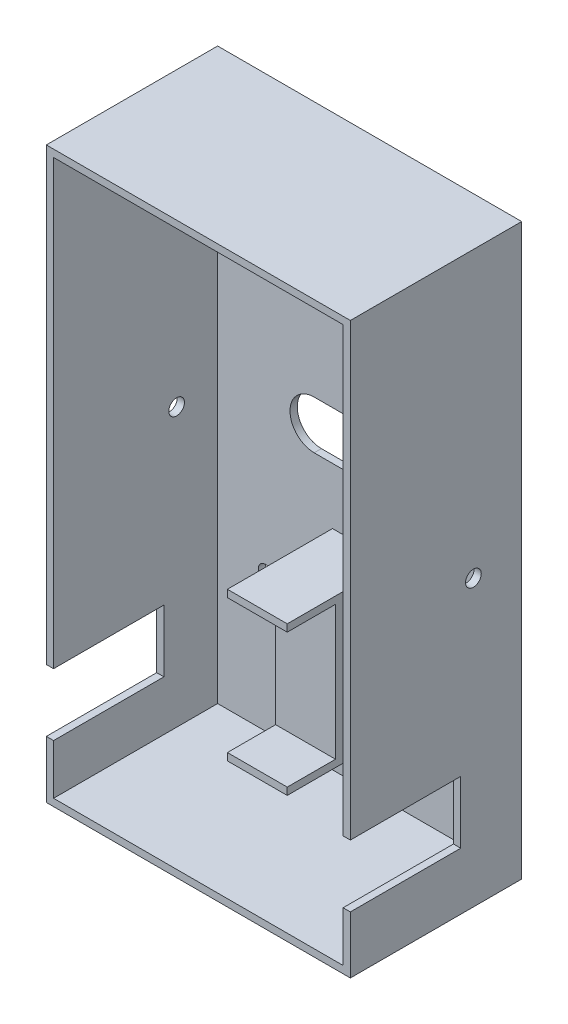
ISO-10303-21;
HEADER;
FILE_DESCRIPTION(('STEP AP214'),'2;1');
FILE_NAME('part.step','',(''),(''),'','','');
FILE_SCHEMA(('AUTOMOTIVE_DESIGN { 1 0 10303 214 1 1 1 1 }'));
ENDSEC;
DATA;
#1=APPLICATION_CONTEXT('core data for automotive mechanical design processes');
#2=APPLICATION_PROTOCOL_DEFINITION('international standard','automotive_design',2000,#1);
#3=PRODUCT_CONTEXT('',#1,'mechanical');
#4=PRODUCT('Part','Part','',(#3));
#5=PRODUCT_RELATED_PRODUCT_CATEGORY('part','',(#4));
#6=PRODUCT_DEFINITION_FORMATION('','',#4);
#7=PRODUCT_DEFINITION_CONTEXT('part definition',#1,'design');
#8=PRODUCT_DEFINITION('design','',#6,#7);
#9=PRODUCT_DEFINITION_SHAPE('','',#8);
#10=(LENGTH_UNIT() NAMED_UNIT(*) SI_UNIT(.MILLI.,.METRE.));
#11=(NAMED_UNIT(*) PLANE_ANGLE_UNIT() SI_UNIT($,.RADIAN.));
#12=(NAMED_UNIT(*) SI_UNIT($,.STERADIAN.) SOLID_ANGLE_UNIT());
#13=UNCERTAINTY_MEASURE_WITH_UNIT(LENGTH_MEASURE(1.E-05),#10,'distance_accuracy_value','');
#14=(GEOMETRIC_REPRESENTATION_CONTEXT(3) GLOBAL_UNCERTAINTY_ASSIGNED_CONTEXT((#13)) GLOBAL_UNIT_ASSIGNED_CONTEXT((#10,
#11,#12)) REPRESENTATION_CONTEXT('',''));
#15=CARTESIAN_POINT('',(0.,0.,0.));
#16=DIRECTION('',(0.,0.,1.));
#17=DIRECTION('',(1.,0.,0.));
#18=AXIS2_PLACEMENT_3D('',#15,#16,#17);
#19=CARTESIAN_POINT('',(0.,0.,34.));
#20=DIRECTION('',(0.,0.,1.));
#21=DIRECTION('',(1.,0.,0.));
#22=AXIS2_PLACEMENT_3D('',#19,#20,#21);
#23=PLANE('',#22);
#24=DIRECTION('',(-1.,0.,0.));
#25=VECTOR('',#24,1.);
#26=CARTESIAN_POINT('',(61.501,23.25,34.));
#27=LINE('',#26,#25);
#28=CARTESIAN_POINT('',(0.,23.25,34.));
#29=VERTEX_POINT('',#28);
#30=CARTESIAN_POINT('',(-1.5,23.25,34.));
#31=VERTEX_POINT('',#30);
#32=EDGE_CURVE('E275',#29,#31,#27,.T.);
#33=ORIENTED_EDGE('',*,*,#32,.F.);
#34=DIRECTION('',(0.,-1.,0.));
#35=VECTOR('',#34,1.);
#36=CARTESIAN_POINT('',(0.,115.,34.));
#37=LINE('',#36,#35);
#38=CARTESIAN_POINT('',(0.,115.,34.));
#39=VERTEX_POINT('',#38);
#40=EDGE_CURVE('E378',#39,#29,#37,.T.);
#41=ORIENTED_EDGE('',*,*,#40,.F.);
#42=DIRECTION('',(-1.,0.,0.));
#43=VECTOR('',#42,1.);
#44=CARTESIAN_POINT('',(60.,115.,34.));
#45=LINE('',#44,#43);
#46=CARTESIAN_POINT('',(60.,115.,34.));
#47=VERTEX_POINT('',#46);
#48=EDGE_CURVE('E361',#47,#39,#45,.T.);
#49=ORIENTED_EDGE('',*,*,#48,.F.);
#50=DIRECTION('',(0.,1.,0.));
#51=VECTOR('',#50,1.);
#52=CARTESIAN_POINT('',(60.,0.,34.));
#53=LINE('',#52,#51);
#54=CARTESIAN_POINT('',(60.,23.25,34.));
#55=VERTEX_POINT('',#54);
#56=EDGE_CURVE('E384',#55,#47,#53,.T.);
#57=ORIENTED_EDGE('',*,*,#56,.F.);
#58=DIRECTION('',(1.,0.,0.));
#59=VECTOR('',#58,1.);
#60=CARTESIAN_POINT('',(-1.501,23.25,34.));
#61=LINE('',#60,#59);
#62=CARTESIAN_POINT('',(61.5,23.25,34.));
#63=VERTEX_POINT('',#62);
#64=EDGE_CURVE('E294',#55,#63,#61,.T.);
#65=ORIENTED_EDGE('',*,*,#64,.T.);
#66=DIRECTION('',(0.,1.,0.));
#67=VECTOR('',#66,1.);
#68=CARTESIAN_POINT('',(61.5,-1.5,34.));
#69=LINE('',#68,#67);
#70=CARTESIAN_POINT('',(61.5,116.5,34.));
#71=VERTEX_POINT('',#70);
#72=EDGE_CURVE('E418',#63,#71,#69,.T.);
#73=ORIENTED_EDGE('',*,*,#72,.T.);
#74=DIRECTION('',(-1.,0.,0.));
#75=VECTOR('',#74,1.);
#76=CARTESIAN_POINT('',(61.5,116.5,34.));
#77=LINE('',#76,#75);
#78=CARTESIAN_POINT('',(-1.5,116.5,34.));
#79=VERTEX_POINT('',#78);
#80=EDGE_CURVE('E402',#71,#79,#77,.T.);
#81=ORIENTED_EDGE('',*,*,#80,.T.);
#82=DIRECTION('',(0.,-1.,0.));
#83=VECTOR('',#82,1.);
#84=CARTESIAN_POINT('',(-1.5,116.5,34.));
#85=LINE('',#84,#83);
#86=EDGE_CURVE('E412',#79,#31,#85,.T.);
#87=ORIENTED_EDGE('',*,*,#86,.T.);
#88=EDGE_LOOP('',(#33,#41,#49,#57,#65,#73,#81,#87));
#89=FACE_BOUND('',#88,.T.);
#90=ADVANCED_FACE('F32',(#89),#23,.T.);
#91=CARTESIAN_POINT('',(0.,0.,21.78));
#92=DIRECTION('',(0.,0.,-1.));
#93=DIRECTION('',(-1.,0.,0.));
#94=AXIS2_PLACEMENT_3D('',#91,#92,#93);
#95=PLANE('',#94);
#96=DIRECTION('',(0.,-1.,0.));
#97=VECTOR('',#96,1.);
#98=CARTESIAN_POINT('',(23.8,12.5,21.78));
#99=LINE('',#98,#97);
#100=CARTESIAN_POINT('',(23.8,43.3,21.78));
#101=VERTEX_POINT('',#100);
#102=CARTESIAN_POINT('',(23.8,41.8,21.78));
#103=VERTEX_POINT('',#102);
#104=EDGE_CURVE('E334',#101,#103,#99,.T.);
#105=ORIENTED_EDGE('',*,*,#104,.T.);
#106=DIRECTION('',(-1.,0.,0.));
#107=VECTOR('',#106,1.);
#108=CARTESIAN_POINT('',(61.501,41.8,21.78));
#109=LINE('',#108,#107);
#110=CARTESIAN_POINT('',(36.2,41.8,21.78));
#111=VERTEX_POINT('',#110);
#112=EDGE_CURVE('E307',#111,#103,#109,.T.);
#113=ORIENTED_EDGE('',*,*,#112,.F.);
#114=DIRECTION('',(0.,1.,0.));
#115=VECTOR('',#114,1.);
#116=CARTESIAN_POINT('',(36.2,43.3,21.78));
#117=LINE('',#116,#115);
#118=CARTESIAN_POINT('',(36.2,43.3,21.78));
#119=VERTEX_POINT('',#118);
#120=EDGE_CURVE('E339',#111,#119,#117,.T.);
#121=ORIENTED_EDGE('',*,*,#120,.T.);
#122=DIRECTION('',(-1.,0.,0.));
#123=VECTOR('',#122,1.);
#124=CARTESIAN_POINT('',(23.8,43.3,21.78));
#125=LINE('',#124,#123);
#126=EDGE_CURVE('E329',#119,#101,#125,.T.);
#127=ORIENTED_EDGE('',*,*,#126,.T.);
#128=EDGE_LOOP('',(#105,#113,#121,#127));
#129=FACE_BOUND('',#128,.T.);
#130=ADVANCED_FACE('F506',(#129),#95,.F.);
#131=CARTESIAN_POINT('',(0.,0.,0.));
#132=DIRECTION('',(0.,0.,1.));
#133=DIRECTION('',(1.,0.,0.));
#134=AXIS2_PLACEMENT_3D('',#131,#132,#133);
#135=PLANE('',#134);
#136=CARTESIAN_POINT('',(9.95,28.42,0.));
#137=DIRECTION('',(0.,0.,1.));
#138=DIRECTION('',(1.,0.,0.));
#139=AXIS2_PLACEMENT_3D('',#136,#137,#138);
#140=CIRCLE('',#139,1.52499999999999);
#141=CARTESIAN_POINT('',(11.475,28.42,0.));
#142=VERTEX_POINT('',#141);
#143=EDGE_CURVE('E800',#142,#142,#140,.T.);
#144=ORIENTED_EDGE('',*,*,#143,.F.);
#145=EDGE_LOOP('',(#144));
#146=FACE_BOUND('',#145,.T.);
#147=CARTESIAN_POINT('',(9.95,21.935,0.));
#148=DIRECTION('',(0.,0.,1.));
#149=DIRECTION('',(1.,0.,0.));
#150=AXIS2_PLACEMENT_3D('',#147,#148,#149);
#151=CIRCLE('',#150,1.52499999999999);
#152=CARTESIAN_POINT('',(11.475,21.935,0.));
#153=VERTEX_POINT('',#152);
#154=EDGE_CURVE('E806',#153,#153,#151,.T.);
#155=ORIENTED_EDGE('',*,*,#154,.F.);
#156=EDGE_LOOP('',(#155));
#157=FACE_BOUND('',#156,.T.);
#158=CARTESIAN_POINT('',(50.05,28.42,0.));
#159=DIRECTION('',(0.,0.,1.));
#160=DIRECTION('',(1.,0.,0.));
#161=AXIS2_PLACEMENT_3D('',#158,#159,#160);
#162=CIRCLE('',#161,1.52499999999998);
#163=CARTESIAN_POINT('',(51.575,28.42,0.));
#164=VERTEX_POINT('',#163);
#165=EDGE_CURVE('E36',#164,#164,#162,.T.);
#166=ORIENTED_EDGE('',*,*,#165,.F.);
#167=EDGE_LOOP('',(#166));
#168=FACE_BOUND('',#167,.T.);
#169=CARTESIAN_POINT('',(50.05,21.935,0.));
#170=DIRECTION('',(0.,0.,1.));
#171=DIRECTION('',(1.,0.,0.));
#172=AXIS2_PLACEMENT_3D('',#169,#170,#171);
#173=CIRCLE('',#172,1.52499999999998);
#174=CARTESIAN_POINT('',(51.575,21.935,0.));
#175=VERTEX_POINT('',#174);
#176=EDGE_CURVE('E815',#175,#175,#173,.T.);
#177=ORIENTED_EDGE('',*,*,#176,.F.);
#178=EDGE_LOOP('',(#177));
#179=FACE_BOUND('',#178,.T.);
#180=CARTESIAN_POINT('',(40.,60.,0.));
#181=DIRECTION('',(0.,0.,1.));
#182=DIRECTION('',(1.,0.,0.));
#183=AXIS2_PLACEMENT_3D('',#180,#181,#182);
#184=CIRCLE('',#183,5.);
#185=CARTESIAN_POINT('',(40.,55.,0.));
#186=VERTEX_POINT('',#185);
#187=CARTESIAN_POINT('',(40.,65.,0.));
#188=VERTEX_POINT('',#187);
#189=EDGE_CURVE('E251',#186,#188,#184,.T.);
#190=ORIENTED_EDGE('',*,*,#189,.F.);
#191=DIRECTION('',(1.,0.,0.));
#192=VECTOR('',#191,1.);
#193=CARTESIAN_POINT('',(0.,55.,0.));
#194=LINE('',#193,#192);
#195=CARTESIAN_POINT('',(20.,55.,0.));
#196=VERTEX_POINT('',#195);
#197=EDGE_CURVE('E244',#196,#186,#194,.T.);
#198=ORIENTED_EDGE('',*,*,#197,.F.);
#199=CARTESIAN_POINT('',(20.,60.,0.));
#200=DIRECTION('',(0.,0.,1.));
#201=DIRECTION('',(1.,0.,0.));
#202=AXIS2_PLACEMENT_3D('',#199,#200,#201);
#203=CIRCLE('',#202,5.);
#204=CARTESIAN_POINT('',(20.,65.,0.));
#205=VERTEX_POINT('',#204);
#206=EDGE_CURVE('E224',#205,#196,#203,.T.);
#207=ORIENTED_EDGE('',*,*,#206,.F.);
#208=DIRECTION('',(-1.,0.,0.));
#209=VECTOR('',#208,1.);
#210=CARTESIAN_POINT('',(0.,65.,0.));
#211=LINE('',#210,#209);
#212=EDGE_CURVE('E249',#188,#205,#211,.T.);
#213=ORIENTED_EDGE('',*,*,#212,.F.);
#214=EDGE_LOOP('',(#190,#198,#207,#213));
#215=FACE_BOUND('',#214,.T.);
#216=DIRECTION('',(-1.,0.,0.));
#217=VECTOR('',#216,1.);
#218=CARTESIAN_POINT('',(60.,115.,0.));
#219=LINE('',#218,#217);
#220=CARTESIAN_POINT('',(60.,115.,0.));
#221=VERTEX_POINT('',#220);
#222=CARTESIAN_POINT('',(0.,115.,0.));
#223=VERTEX_POINT('',#222);
#224=EDGE_CURVE('E362',#221,#223,#219,.T.);
#225=ORIENTED_EDGE('',*,*,#224,.T.);
#226=DIRECTION('',(0.,-1.,0.));
#227=VECTOR('',#226,1.);
#228=CARTESIAN_POINT('',(0.,115.,0.));
#229=LINE('',#228,#227);
#230=CARTESIAN_POINT('',(0.,0.,0.));
#231=VERTEX_POINT('',#230);
#232=EDGE_CURVE('E365',#223,#231,#229,.T.);
#233=ORIENTED_EDGE('',*,*,#232,.T.);
#234=DIRECTION('',(1.,0.,0.));
#235=VECTOR('',#234,1.);
#236=CARTESIAN_POINT('',(0.,0.,0.));
#237=LINE('',#236,#235);
#238=CARTESIAN_POINT('',(60.,0.,0.));
#239=VERTEX_POINT('',#238);
#240=EDGE_CURVE('E369',#231,#239,#237,.T.);
#241=ORIENTED_EDGE('',*,*,#240,.T.);
#242=DIRECTION('',(0.,1.,0.));
#243=VECTOR('',#242,1.);
#244=CARTESIAN_POINT('',(60.,0.,0.));
#245=LINE('',#244,#243);
#246=EDGE_CURVE('E372',#239,#221,#245,.T.);
#247=ORIENTED_EDGE('',*,*,#246,.T.);
#248=EDGE_LOOP('',(#225,#233,#241,#247));
#249=FACE_BOUND('',#248,.T.);
#250=DIRECTION('',(0.,-1.,0.));
#251=VECTOR('',#250,1.);
#252=CARTESIAN_POINT('',(23.8,12.5,0.));
#253=LINE('',#252,#251);
#254=CARTESIAN_POINT('',(23.8,43.3,0.));
#255=VERTEX_POINT('',#254);
#256=CARTESIAN_POINT('',(23.8,12.5,0.));
#257=VERTEX_POINT('',#256);
#258=EDGE_CURVE('E346',#255,#257,#253,.T.);
#259=ORIENTED_EDGE('',*,*,#258,.F.);
#260=DIRECTION('',(-1.,0.,0.));
#261=VECTOR('',#260,1.);
#262=CARTESIAN_POINT('',(23.8,43.3,0.));
#263=LINE('',#262,#261);
#264=CARTESIAN_POINT('',(36.2,43.3,0.));
#265=VERTEX_POINT('',#264);
#266=EDGE_CURVE('E328',#265,#255,#263,.T.);
#267=ORIENTED_EDGE('',*,*,#266,.F.);
#268=DIRECTION('',(0.,1.,0.));
#269=VECTOR('',#268,1.);
#270=CARTESIAN_POINT('',(36.2,43.3,0.));
#271=LINE('',#270,#269);
#272=CARTESIAN_POINT('',(36.2,12.5,0.));
#273=VERTEX_POINT('',#272);
#274=EDGE_CURVE('E333',#273,#265,#271,.T.);
#275=ORIENTED_EDGE('',*,*,#274,.F.);
#276=DIRECTION('',(1.,0.,0.));
#277=VECTOR('',#276,1.);
#278=CARTESIAN_POINT('',(36.2,12.5,0.));
#279=LINE('',#278,#277);
#280=EDGE_CURVE('E348',#257,#273,#279,.T.);
#281=ORIENTED_EDGE('',*,*,#280,.F.);
#282=EDGE_LOOP('',(#259,#267,#275,#281));
#283=FACE_BOUND('',#282,.T.);
#284=ADVANCED_FACE('F483',(#146,#157,#168,#179,#215,#249,#283),#135,.T.);
#285=CARTESIAN_POINT('',(-1.5,116.5,-1.5));
#286=DIRECTION('',(-1.,0.,0.));
#287=DIRECTION('',(0.,-1.,0.));
#288=AXIS2_PLACEMENT_3D('',#285,#286,#287);
#289=PLANE('',#288);
#290=CARTESIAN_POINT('',(-1.5,57.5,8.5));
#291=DIRECTION('',(1.,0.,0.));
#292=DIRECTION('',(0.,0.,-1.));
#293=AXIS2_PLACEMENT_3D('',#290,#291,#292);
#294=CIRCLE('',#293,1.62559999999998);
#295=CARTESIAN_POINT('',(-1.5,57.5,6.87440000000002));
#296=VERTEX_POINT('',#295);
#297=EDGE_CURVE('E791',#296,#296,#294,.T.);
#298=ORIENTED_EDGE('',*,*,#297,.T.);
#299=EDGE_LOOP('',(#298));
#300=FACE_BOUND('',#299,.T.);
#301=DIRECTION('',(0.,0.,-1.));
#302=VECTOR('',#301,1.);
#303=CARTESIAN_POINT('',(-1.5,23.25,34.));
#304=LINE('',#303,#302);
#305=CARTESIAN_POINT('',(-1.5,23.25,11.13));
#306=VERTEX_POINT('',#305);
#307=EDGE_CURVE('E263',#31,#306,#304,.T.);
#308=ORIENTED_EDGE('',*,*,#307,.F.);
#309=ORIENTED_EDGE('',*,*,#86,.F.);
#310=DIRECTION('',(0.,0.,1.));
#311=VECTOR('',#310,1.);
#312=CARTESIAN_POINT('',(-1.5,116.5,-1.5));
#313=LINE('',#312,#311);
#314=CARTESIAN_POINT('',(-1.5,116.5,-1.5));
#315=VERTEX_POINT('',#314);
#316=EDGE_CURVE('E11',#315,#79,#313,.T.);
#317=ORIENTED_EDGE('',*,*,#316,.F.);
#318=DIRECTION('',(0.,-1.,0.));
#319=VECTOR('',#318,1.);
#320=CARTESIAN_POINT('',(-1.5,116.5,-1.5));
#321=LINE('',#320,#319);
#322=CARTESIAN_POINT('',(-1.5,-1.5,-1.5));
#323=VERTEX_POINT('',#322);
#324=EDGE_CURVE('E398',#315,#323,#321,.T.);
#325=ORIENTED_EDGE('',*,*,#324,.T.);
#326=DIRECTION('',(0.,0.,1.));
#327=VECTOR('',#326,1.);
#328=CARTESIAN_POINT('',(-1.5,-1.5,-1.5));
#329=LINE('',#328,#327);
#330=CARTESIAN_POINT('',(-1.5,-1.5,34.));
#331=VERTEX_POINT('',#330);
#332=EDGE_CURVE('E411',#323,#331,#329,.T.);
#333=ORIENTED_EDGE('',*,*,#332,.T.);
#334=CARTESIAN_POINT('',(-1.5,10.36,34.));
#335=VERTEX_POINT('',#334);
#336=EDGE_CURVE('E390',#335,#331,#85,.T.);
#337=ORIENTED_EDGE('',*,*,#336,.F.);
#338=DIRECTION('',(0.,0.,1.));
#339=VECTOR('',#338,1.);
#340=CARTESIAN_POINT('',(-1.5,10.36,11.13));
#341=LINE('',#340,#339);
#342=CARTESIAN_POINT('',(-1.5,10.36,11.13));
#343=VERTEX_POINT('',#342);
#344=EDGE_CURVE('E261',#343,#335,#341,.T.);
#345=ORIENTED_EDGE('',*,*,#344,.F.);
#346=DIRECTION('',(0.,-1.,0.));
#347=VECTOR('',#346,1.);
#348=CARTESIAN_POINT('',(-1.5,23.25,11.13));
#349=LINE('',#348,#347);
#350=EDGE_CURVE('E266',#306,#343,#349,.T.);
#351=ORIENTED_EDGE('',*,*,#350,.F.);
#352=EDGE_LOOP('',(#308,#309,#317,#325,#333,#337,#345,#351));
#353=FACE_BOUND('',#352,.T.);
#354=ADVANCED_FACE('F34',(#300,#353),#289,.T.);
#355=CARTESIAN_POINT('',(61.5,116.5,-1.5));
#356=DIRECTION('',(0.,1.,0.));
#357=DIRECTION('',(0.,0.,1.));
#358=AXIS2_PLACEMENT_3D('',#355,#356,#357);
#359=PLANE('',#358);
#360=ORIENTED_EDGE('',*,*,#80,.F.);
#361=DIRECTION('',(0.,0.,1.));
#362=VECTOR('',#361,1.);
#363=CARTESIAN_POINT('',(61.5,116.5,-1.5));
#364=LINE('',#363,#362);
#365=CARTESIAN_POINT('',(61.5,116.5,-1.5));
#366=VERTEX_POINT('',#365);
#367=EDGE_CURVE('E41',#366,#71,#364,.T.);
#368=ORIENTED_EDGE('',*,*,#367,.F.);
#369=DIRECTION('',(-1.,0.,0.));
#370=VECTOR('',#369,1.);
#371=CARTESIAN_POINT('',(61.5,116.5,-1.5));
#372=LINE('',#371,#370);
#373=EDGE_CURVE('E408',#366,#315,#372,.T.);
#374=ORIENTED_EDGE('',*,*,#373,.T.);
#375=ORIENTED_EDGE('',*,*,#316,.T.);
#376=EDGE_LOOP('',(#360,#368,#374,#375));
#377=FACE_BOUND('',#376,.T.);
#378=ADVANCED_FACE('F461',(#377),#359,.T.);
#379=CARTESIAN_POINT('',(61.5,-1.5,-1.5));
#380=DIRECTION('',(1.,0.,0.));
#381=DIRECTION('',(0.,0.,-1.));
#382=AXIS2_PLACEMENT_3D('',#379,#380,#381);
#383=PLANE('',#382);
#384=CARTESIAN_POINT('',(61.5,57.5,8.5));
#385=DIRECTION('',(1.,0.,0.));
#386=DIRECTION('',(0.,0.,-1.));
#387=AXIS2_PLACEMENT_3D('',#384,#385,#386);
#388=CIRCLE('',#387,1.62559999999998);
#389=CARTESIAN_POINT('',(61.5,57.5,6.87440000000002));
#390=VERTEX_POINT('',#389);
#391=EDGE_CURVE('E784',#390,#390,#388,.T.);
#392=ORIENTED_EDGE('',*,*,#391,.F.);
#393=EDGE_LOOP('',(#392));
#394=FACE_BOUND('',#393,.T.);
#395=DIRECTION('',(0.,0.,-1.));
#396=VECTOR('',#395,1.);
#397=CARTESIAN_POINT('',(61.5,10.36,34.));
#398=LINE('',#397,#396);
#399=CARTESIAN_POINT('',(61.5,10.36,34.));
#400=VERTEX_POINT('',#399);
#401=CARTESIAN_POINT('',(61.5,10.36,11.13));
#402=VERTEX_POINT('',#401);
#403=EDGE_CURVE('E288',#400,#402,#398,.T.);
#404=ORIENTED_EDGE('',*,*,#403,.F.);
#405=CARTESIAN_POINT('',(61.5,-1.5,34.));
#406=VERTEX_POINT('',#405);
#407=EDGE_CURVE('E419',#406,#400,#69,.T.);
#408=ORIENTED_EDGE('',*,*,#407,.F.);
#409=DIRECTION('',(0.,0.,1.));
#410=VECTOR('',#409,1.);
#411=CARTESIAN_POINT('',(61.5,-1.5,-1.5));
#412=LINE('',#411,#410);
#413=CARTESIAN_POINT('',(61.5,-1.5,-1.5));
#414=VERTEX_POINT('',#413);
#415=EDGE_CURVE('E426',#414,#406,#412,.T.);
#416=ORIENTED_EDGE('',*,*,#415,.F.);
#417=DIRECTION('',(0.,1.,0.));
#418=VECTOR('',#417,1.);
#419=CARTESIAN_POINT('',(61.5,-1.5,-1.5));
#420=LINE('',#419,#418);
#421=EDGE_CURVE('E405',#414,#366,#420,.T.);
#422=ORIENTED_EDGE('',*,*,#421,.T.);
#423=ORIENTED_EDGE('',*,*,#367,.T.);
#424=ORIENTED_EDGE('',*,*,#72,.F.);
#425=DIRECTION('',(0.,0.,1.));
#426=VECTOR('',#425,1.);
#427=CARTESIAN_POINT('',(61.5,23.25,11.13));
#428=LINE('',#427,#426);
#429=CARTESIAN_POINT('',(61.5,23.25,11.13));
#430=VERTEX_POINT('',#429);
#431=EDGE_CURVE('E286',#430,#63,#428,.T.);
#432=ORIENTED_EDGE('',*,*,#431,.F.);
#433=DIRECTION('',(0.,1.,0.));
#434=VECTOR('',#433,1.);
#435=CARTESIAN_POINT('',(61.5,10.36,11.13));
#436=LINE('',#435,#434);
#437=EDGE_CURVE('E291',#402,#430,#436,.T.);
#438=ORIENTED_EDGE('',*,*,#437,.F.);
#439=EDGE_LOOP('',(#404,#408,#416,#422,#423,#424,#432,#438));
#440=FACE_BOUND('',#439,.T.);
#441=ADVANCED_FACE('F466',(#394,#440),#383,.T.);
#442=CARTESIAN_POINT('',(-1.5,-1.5,-1.5));
#443=DIRECTION('',(0.,-1.,0.));
#444=DIRECTION('',(1.,0.,0.));
#445=AXIS2_PLACEMENT_3D('',#442,#443,#444);
#446=PLANE('',#445);
#447=DIRECTION('',(1.,0.,0.));
#448=VECTOR('',#447,1.);
#449=CARTESIAN_POINT('',(-1.5,-1.5,34.));
#450=LINE('',#449,#448);
#451=EDGE_CURVE('E415',#331,#406,#450,.T.);
#452=ORIENTED_EDGE('',*,*,#451,.F.);
#453=ORIENTED_EDGE('',*,*,#332,.F.);
#454=DIRECTION('',(1.,0.,0.));
#455=VECTOR('',#454,1.);
#456=CARTESIAN_POINT('',(-1.5,-1.5,-1.5));
#457=LINE('',#456,#455);
#458=EDGE_CURVE('E401',#323,#414,#457,.T.);
#459=ORIENTED_EDGE('',*,*,#458,.T.);
#460=ORIENTED_EDGE('',*,*,#415,.T.);
#461=EDGE_LOOP('',(#452,#453,#459,#460));
#462=FACE_BOUND('',#461,.T.);
#463=ADVANCED_FACE('F436',(#462),#446,.T.);
#464=CARTESIAN_POINT('',(0.,0.,-1.5));
#465=DIRECTION('',(0.,0.,1.));
#466=DIRECTION('',(1.,0.,0.));
#467=AXIS2_PLACEMENT_3D('',#464,#465,#466);
#468=PLANE('',#467);
#469=CARTESIAN_POINT('',(9.95,28.42,-1.5));
#470=DIRECTION('',(0.,0.,-1.));
#471=DIRECTION('',(-1.,0.,0.));
#472=AXIS2_PLACEMENT_3D('',#469,#470,#471);
#473=CIRCLE('',#472,1.52499999999999);
#474=CARTESIAN_POINT('',(8.42500000000001,28.42,-1.5));
#475=VERTEX_POINT('',#474);
#476=EDGE_CURVE('E797',#475,#475,#473,.T.);
#477=ORIENTED_EDGE('',*,*,#476,.F.);
#478=EDGE_LOOP('',(#477));
#479=FACE_BOUND('',#478,.T.);
#480=CARTESIAN_POINT('',(9.95,21.935,-1.5));
#481=DIRECTION('',(0.,0.,-1.));
#482=DIRECTION('',(-1.,0.,0.));
#483=AXIS2_PLACEMENT_3D('',#480,#481,#482);
#484=CIRCLE('',#483,1.52499999999999);
#485=CARTESIAN_POINT('',(8.42500000000001,21.935,-1.5));
#486=VERTEX_POINT('',#485);
#487=EDGE_CURVE('E803',#486,#486,#484,.T.);
#488=ORIENTED_EDGE('',*,*,#487,.F.);
#489=EDGE_LOOP('',(#488));
#490=FACE_BOUND('',#489,.T.);
#491=CARTESIAN_POINT('',(50.05,28.42,-1.5));
#492=DIRECTION('',(0.,0.,-1.));
#493=DIRECTION('',(-1.,0.,0.));
#494=AXIS2_PLACEMENT_3D('',#491,#492,#493);
#495=CIRCLE('',#494,1.52499999999998);
#496=CARTESIAN_POINT('',(48.525,28.42,-1.5));
#497=VERTEX_POINT('',#496);
#498=EDGE_CURVE('E809',#497,#497,#495,.T.);
#499=ORIENTED_EDGE('',*,*,#498,.F.);
#500=EDGE_LOOP('',(#499));
#501=FACE_BOUND('',#500,.T.);
#502=CARTESIAN_POINT('',(50.05,21.935,-1.5));
#503=DIRECTION('',(0.,0.,-1.));
#504=DIRECTION('',(-1.,0.,0.));
#505=AXIS2_PLACEMENT_3D('',#502,#503,#504);
#506=CIRCLE('',#505,1.52499999999998);
#507=CARTESIAN_POINT('',(48.525,21.935,-1.5));
#508=VERTEX_POINT('',#507);
#509=EDGE_CURVE('E812',#508,#508,#506,.T.);
#510=ORIENTED_EDGE('',*,*,#509,.F.);
#511=EDGE_LOOP('',(#510));
#512=FACE_BOUND('',#511,.T.);
#513=DIRECTION('',(-1.,0.,0.));
#514=VECTOR('',#513,1.);
#515=CARTESIAN_POINT('',(40.,55.,-1.5));
#516=LINE('',#515,#514);
#517=CARTESIAN_POINT('',(40.,55.,-1.5));
#518=VERTEX_POINT('',#517);
#519=CARTESIAN_POINT('',(20.,55.,-1.5));
#520=VERTEX_POINT('',#519);
#521=EDGE_CURVE('E230',#518,#520,#516,.T.);
#522=ORIENTED_EDGE('',*,*,#521,.F.);
#523=CARTESIAN_POINT('',(40.,60.,-1.5));
#524=DIRECTION('',(0.,0.,-1.));
#525=DIRECTION('',(-1.,0.,0.));
#526=AXIS2_PLACEMENT_3D('',#523,#524,#525);
#527=CIRCLE('',#526,5.);
#528=CARTESIAN_POINT('',(40.,65.,-1.5));
#529=VERTEX_POINT('',#528);
#530=EDGE_CURVE('E57',#529,#518,#527,.T.);
#531=ORIENTED_EDGE('',*,*,#530,.F.);
#532=DIRECTION('',(1.,0.,0.));
#533=VECTOR('',#532,1.);
#534=CARTESIAN_POINT('',(20.,65.,-1.5));
#535=LINE('',#534,#533);
#536=CARTESIAN_POINT('',(20.,65.,-1.5));
#537=VERTEX_POINT('',#536);
#538=EDGE_CURVE('E237',#537,#529,#535,.T.);
#539=ORIENTED_EDGE('',*,*,#538,.F.);
#540=CARTESIAN_POINT('',(20.,60.,-1.5));
#541=DIRECTION('',(0.,0.,-1.));
#542=DIRECTION('',(-1.,0.,0.));
#543=AXIS2_PLACEMENT_3D('',#540,#541,#542);
#544=CIRCLE('',#543,5.);
#545=EDGE_CURVE('E221',#520,#537,#544,.T.);
#546=ORIENTED_EDGE('',*,*,#545,.F.);
#547=EDGE_LOOP('',(#522,#531,#539,#546));
#548=FACE_BOUND('',#547,.T.);
#549=ORIENTED_EDGE('',*,*,#324,.F.);
#550=ORIENTED_EDGE('',*,*,#373,.F.);
#551=ORIENTED_EDGE('',*,*,#421,.F.);
#552=ORIENTED_EDGE('',*,*,#458,.F.);
#553=EDGE_LOOP('',(#549,#550,#551,#552));
#554=FACE_BOUND('',#553,.T.);
#555=ADVANCED_FACE('F234',(#479,#490,#501,#512,#548,#554),#468,.F.);
#556=DIRECTION('',(-1.,0.,0.));
#557=VECTOR('',#556,1.);
#558=CARTESIAN_POINT('',(61.501,10.36,34.));
#559=LINE('',#558,#557);
#560=CARTESIAN_POINT('',(0.,10.36,34.));
#561=VERTEX_POINT('',#560);
#562=EDGE_CURVE('E269',#561,#335,#559,.T.);
#563=ORIENTED_EDGE('',*,*,#562,.T.);
#564=ORIENTED_EDGE('',*,*,#336,.T.);
#565=ORIENTED_EDGE('',*,*,#451,.T.);
#566=ORIENTED_EDGE('',*,*,#407,.T.);
#567=DIRECTION('',(1.,0.,0.));
#568=VECTOR('',#567,1.);
#569=CARTESIAN_POINT('',(-1.501,10.36,34.));
#570=LINE('',#569,#568);
#571=CARTESIAN_POINT('',(60.,10.36,34.));
#572=VERTEX_POINT('',#571);
#573=EDGE_CURVE('E300',#572,#400,#570,.T.);
#574=ORIENTED_EDGE('',*,*,#573,.F.);
#575=CARTESIAN_POINT('',(60.,0.,34.));
#576=VERTEX_POINT('',#575);
#577=EDGE_CURVE('E366',#576,#572,#53,.T.);
#578=ORIENTED_EDGE('',*,*,#577,.F.);
#579=DIRECTION('',(1.,0.,0.));
#580=VECTOR('',#579,1.);
#581=CARTESIAN_POINT('',(0.,0.,34.));
#582=LINE('',#581,#580);
#583=CARTESIAN_POINT('',(0.,0.,34.));
#584=VERTEX_POINT('',#583);
#585=EDGE_CURVE('E381',#584,#576,#582,.T.);
#586=ORIENTED_EDGE('',*,*,#585,.F.);
#587=EDGE_CURVE('E377',#561,#584,#37,.T.);
#588=ORIENTED_EDGE('',*,*,#587,.F.);
#589=EDGE_LOOP('',(#563,#564,#565,#566,#574,#578,#586,#588));
#590=FACE_BOUND('',#589,.T.);
#591=ADVANCED_FACE('F439',(#590),#23,.T.);
#592=CARTESIAN_POINT('',(60.,115.,0.));
#593=DIRECTION('',(0.,1.,0.));
#594=DIRECTION('',(0.,0.,1.));
#595=AXIS2_PLACEMENT_3D('',#592,#593,#594);
#596=PLANE('',#595);
#597=ORIENTED_EDGE('',*,*,#48,.T.);
#598=DIRECTION('',(0.,0.,1.));
#599=VECTOR('',#598,1.);
#600=CARTESIAN_POINT('',(0.,115.,0.));
#601=LINE('',#600,#599);
#602=EDGE_CURVE('E375',#223,#39,#601,.T.);
#603=ORIENTED_EDGE('',*,*,#602,.F.);
#604=ORIENTED_EDGE('',*,*,#224,.F.);
#605=DIRECTION('',(0.,0.,1.));
#606=VECTOR('',#605,1.);
#607=CARTESIAN_POINT('',(60.,115.,0.));
#608=LINE('',#607,#606);
#609=EDGE_CURVE('E387',#221,#47,#608,.T.);
#610=ORIENTED_EDGE('',*,*,#609,.T.);
#611=EDGE_LOOP('',(#597,#603,#604,#610));
#612=FACE_BOUND('',#611,.T.);
#613=ADVANCED_FACE('F486',(#612),#596,.F.);
#614=CARTESIAN_POINT('',(60.,0.,0.));
#615=DIRECTION('',(1.,0.,0.));
#616=DIRECTION('',(0.,0.,-1.));
#617=AXIS2_PLACEMENT_3D('',#614,#615,#616);
#618=PLANE('',#617);
#619=CARTESIAN_POINT('',(60.,57.5,8.5));
#620=DIRECTION('',(1.,0.,0.));
#621=DIRECTION('',(0.,0.,-1.));
#622=AXIS2_PLACEMENT_3D('',#619,#620,#621);
#623=CIRCLE('',#622,1.62559999999998);
#624=CARTESIAN_POINT('',(60.,57.5,6.87440000000002));
#625=VERTEX_POINT('',#624);
#626=EDGE_CURVE('E787',#625,#625,#623,.T.);
#627=ORIENTED_EDGE('',*,*,#626,.T.);
#628=EDGE_LOOP('',(#627));
#629=FACE_BOUND('',#628,.T.);
#630=ORIENTED_EDGE('',*,*,#577,.T.);
#631=DIRECTION('',(0.,0.,1.));
#632=VECTOR('',#631,1.);
#633=CARTESIAN_POINT('',(60.,10.36,34.));
#634=LINE('',#633,#632);
#635=CARTESIAN_POINT('',(60.,10.36,11.13));
#636=VERTEX_POINT('',#635);
#637=EDGE_CURVE('E272',#636,#572,#634,.T.);
#638=ORIENTED_EDGE('',*,*,#637,.F.);
#639=DIRECTION('',(0.,-1.,0.));
#640=VECTOR('',#639,1.);
#641=CARTESIAN_POINT('',(60.,10.36,11.13));
#642=LINE('',#641,#640);
#643=CARTESIAN_POINT('',(60.,23.25,11.13));
#644=VERTEX_POINT('',#643);
#645=EDGE_CURVE('E280',#644,#636,#642,.T.);
#646=ORIENTED_EDGE('',*,*,#645,.F.);
#647=DIRECTION('',(0.,0.,-1.));
#648=VECTOR('',#647,1.);
#649=CARTESIAN_POINT('',(60.,23.25,11.13));
#650=LINE('',#649,#648);
#651=EDGE_CURVE('E283',#55,#644,#650,.T.);
#652=ORIENTED_EDGE('',*,*,#651,.F.);
#653=ORIENTED_EDGE('',*,*,#56,.T.);
#654=ORIENTED_EDGE('',*,*,#609,.F.);
#655=ORIENTED_EDGE('',*,*,#246,.F.);
#656=DIRECTION('',(0.,0.,1.));
#657=VECTOR('',#656,1.);
#658=CARTESIAN_POINT('',(60.,0.,0.));
#659=LINE('',#658,#657);
#660=EDGE_CURVE('E391',#239,#576,#659,.T.);
#661=ORIENTED_EDGE('',*,*,#660,.T.);
#662=EDGE_LOOP('',(#630,#638,#646,#652,#653,#654,#655,#661));
#663=FACE_BOUND('',#662,.T.);
#664=ADVANCED_FACE('F474',(#629,#663),#618,.F.);
#665=CARTESIAN_POINT('',(0.,0.,0.));
#666=DIRECTION('',(0.,-1.,0.));
#667=DIRECTION('',(0.,0.,-1.));
#668=AXIS2_PLACEMENT_3D('',#665,#666,#667);
#669=PLANE('',#668);
#670=ORIENTED_EDGE('',*,*,#585,.T.);
#671=ORIENTED_EDGE('',*,*,#660,.F.);
#672=ORIENTED_EDGE('',*,*,#240,.F.);
#673=DIRECTION('',(0.,0.,1.));
#674=VECTOR('',#673,1.);
#675=CARTESIAN_POINT('',(0.,0.,0.));
#676=LINE('',#675,#674);
#677=EDGE_CURVE('E393',#231,#584,#676,.T.);
#678=ORIENTED_EDGE('',*,*,#677,.T.);
#679=EDGE_LOOP('',(#670,#671,#672,#678));
#680=FACE_BOUND('',#679,.T.);
#681=ADVANCED_FACE('F479',(#680),#669,.F.);
#682=CARTESIAN_POINT('',(0.,115.,0.));
#683=DIRECTION('',(-1.,0.,0.));
#684=DIRECTION('',(0.,0.,1.));
#685=AXIS2_PLACEMENT_3D('',#682,#683,#684);
#686=PLANE('',#685);
#687=CARTESIAN_POINT('',(0.,57.5,8.5));
#688=DIRECTION('',(1.,0.,0.));
#689=DIRECTION('',(0.,0.,-1.));
#690=AXIS2_PLACEMENT_3D('',#687,#688,#689);
#691=CIRCLE('',#690,1.62559999999998);
#692=CARTESIAN_POINT('',(0.,57.5,6.87440000000002));
#693=VERTEX_POINT('',#692);
#694=EDGE_CURVE('E788',#693,#693,#691,.T.);
#695=ORIENTED_EDGE('',*,*,#694,.F.);
#696=EDGE_LOOP('',(#695));
#697=FACE_BOUND('',#696,.T.);
#698=ORIENTED_EDGE('',*,*,#40,.T.);
#699=DIRECTION('',(0.,0.,1.));
#700=VECTOR('',#699,1.);
#701=CARTESIAN_POINT('',(0.,23.25,34.));
#702=LINE('',#701,#700);
#703=CARTESIAN_POINT('',(0.,23.25,11.13));
#704=VERTEX_POINT('',#703);
#705=EDGE_CURVE('E253',#704,#29,#702,.T.);
#706=ORIENTED_EDGE('',*,*,#705,.F.);
#707=DIRECTION('',(0.,1.,0.));
#708=VECTOR('',#707,1.);
#709=CARTESIAN_POINT('',(0.,23.25,11.13));
#710=LINE('',#709,#708);
#711=CARTESIAN_POINT('',(0.,10.36,11.13));
#712=VERTEX_POINT('',#711);
#713=EDGE_CURVE('E255',#712,#704,#710,.T.);
#714=ORIENTED_EDGE('',*,*,#713,.F.);
#715=DIRECTION('',(0.,0.,-1.));
#716=VECTOR('',#715,1.);
#717=CARTESIAN_POINT('',(0.,10.36,11.13));
#718=LINE('',#717,#716);
#719=EDGE_CURVE('E258',#561,#712,#718,.T.);
#720=ORIENTED_EDGE('',*,*,#719,.F.);
#721=ORIENTED_EDGE('',*,*,#587,.T.);
#722=ORIENTED_EDGE('',*,*,#677,.F.);
#723=ORIENTED_EDGE('',*,*,#232,.F.);
#724=ORIENTED_EDGE('',*,*,#602,.T.);
#725=EDGE_LOOP('',(#698,#706,#714,#720,#721,#722,#723,#724));
#726=FACE_BOUND('',#725,.T.);
#727=ADVANCED_FACE('F448',(#697,#726),#686,.F.);
#728=CARTESIAN_POINT('',(23.8,43.3,21.78));
#729=DIRECTION('',(0.,-1.,0.));
#730=DIRECTION('',(0.,0.,-1.));
#731=AXIS2_PLACEMENT_3D('',#728,#729,#730);
#732=PLANE('',#731);
#733=ORIENTED_EDGE('',*,*,#266,.T.);
#734=DIRECTION('',(0.,0.,-1.));
#735=VECTOR('',#734,1.);
#736=CARTESIAN_POINT('',(23.8,43.3,21.78));
#737=LINE('',#736,#735);
#738=EDGE_CURVE('E359',#101,#255,#737,.T.);
#739=ORIENTED_EDGE('',*,*,#738,.F.);
#740=ORIENTED_EDGE('',*,*,#126,.F.);
#741=DIRECTION('',(0.,0.,-1.));
#742=VECTOR('',#741,1.);
#743=CARTESIAN_POINT('',(36.2,43.3,21.78));
#744=LINE('',#743,#742);
#745=EDGE_CURVE('E343',#119,#265,#744,.T.);
#746=ORIENTED_EDGE('',*,*,#745,.T.);
#747=EDGE_LOOP('',(#733,#739,#740,#746));
#748=FACE_BOUND('',#747,.T.);
#749=ADVANCED_FACE('F531',(#748),#732,.F.);
#750=CARTESIAN_POINT('',(23.8,12.5,21.78));
#751=DIRECTION('',(1.,0.,0.));
#752=DIRECTION('',(0.,0.,-1.));
#753=AXIS2_PLACEMENT_3D('',#750,#751,#752);
#754=PLANE('',#753);
#755=DIRECTION('',(0.,-1.,0.));
#756=VECTOR('',#755,1.);
#757=CARTESIAN_POINT('',(23.8,41.8,11.78));
#758=LINE('',#757,#756);
#759=CARTESIAN_POINT('',(23.8,41.8,11.78));
#760=VERTEX_POINT('',#759);
#761=CARTESIAN_POINT('',(23.8,14.,11.78));
#762=VERTEX_POINT('',#761);
#763=EDGE_CURVE('E304',#760,#762,#758,.T.);
#764=ORIENTED_EDGE('',*,*,#763,.F.);
#765=DIRECTION('',(0.,0.,-1.));
#766=VECTOR('',#765,1.);
#767=CARTESIAN_POINT('',(23.8,41.8,21.78));
#768=LINE('',#767,#766);
#769=EDGE_CURVE('E308',#103,#760,#768,.T.);
#770=ORIENTED_EDGE('',*,*,#769,.F.);
#771=ORIENTED_EDGE('',*,*,#104,.F.);
#772=ORIENTED_EDGE('',*,*,#738,.T.);
#773=ORIENTED_EDGE('',*,*,#258,.T.);
#774=DIRECTION('',(0.,0.,-1.));
#775=VECTOR('',#774,1.);
#776=CARTESIAN_POINT('',(23.8,12.5,21.78));
#777=LINE('',#776,#775);
#778=CARTESIAN_POINT('',(23.8,12.5,21.78));
#779=VERTEX_POINT('',#778);
#780=EDGE_CURVE('E356',#779,#257,#777,.T.);
#781=ORIENTED_EDGE('',*,*,#780,.F.);
#782=CARTESIAN_POINT('',(23.8,14.,21.78));
#783=VERTEX_POINT('',#782);
#784=EDGE_CURVE('E332',#783,#779,#99,.T.);
#785=ORIENTED_EDGE('',*,*,#784,.F.);
#786=DIRECTION('',(0.,0.,1.));
#787=VECTOR('',#786,1.);
#788=CARTESIAN_POINT('',(23.8,14.,11.78));
#789=LINE('',#788,#787);
#790=EDGE_CURVE('E311',#762,#783,#789,.T.);
#791=ORIENTED_EDGE('',*,*,#790,.F.);
#792=EDGE_LOOP('',(#764,#770,#771,#772,#773,#781,#785,#791));
#793=FACE_BOUND('',#792,.T.);
#794=ADVANCED_FACE('F543',(#793),#754,.F.);
#795=CARTESIAN_POINT('',(36.2,12.5,21.78));
#796=DIRECTION('',(0.,1.,0.));
#797=DIRECTION('',(0.,0.,1.));
#798=AXIS2_PLACEMENT_3D('',#795,#796,#797);
#799=PLANE('',#798);
#800=ORIENTED_EDGE('',*,*,#280,.T.);
#801=DIRECTION('',(0.,0.,-1.));
#802=VECTOR('',#801,1.);
#803=CARTESIAN_POINT('',(36.2,12.5,21.78));
#804=LINE('',#803,#802);
#805=CARTESIAN_POINT('',(36.2,12.5,21.78));
#806=VERTEX_POINT('',#805);
#807=EDGE_CURVE('E354',#806,#273,#804,.T.);
#808=ORIENTED_EDGE('',*,*,#807,.F.);
#809=DIRECTION('',(1.,0.,0.));
#810=VECTOR('',#809,1.);
#811=CARTESIAN_POINT('',(36.2,12.5,21.78));
#812=LINE('',#811,#810);
#813=EDGE_CURVE('E337',#779,#806,#812,.T.);
#814=ORIENTED_EDGE('',*,*,#813,.F.);
#815=ORIENTED_EDGE('',*,*,#780,.T.);
#816=EDGE_LOOP('',(#800,#808,#814,#815));
#817=FACE_BOUND('',#816,.T.);
#818=ADVANCED_FACE('F547',(#817),#799,.F.);
#819=CARTESIAN_POINT('',(36.2,43.3,21.78));
#820=DIRECTION('',(-1.,0.,0.));
#821=DIRECTION('',(0.,0.,1.));
#822=AXIS2_PLACEMENT_3D('',#819,#820,#821);
#823=PLANE('',#822);
#824=ORIENTED_EDGE('',*,*,#120,.F.);
#825=DIRECTION('',(0.,0.,1.));
#826=VECTOR('',#825,1.);
#827=CARTESIAN_POINT('',(36.2,41.8,21.78));
#828=LINE('',#827,#826);
#829=CARTESIAN_POINT('',(36.2,41.8,11.78));
#830=VERTEX_POINT('',#829);
#831=EDGE_CURVE('E313',#830,#111,#828,.T.);
#832=ORIENTED_EDGE('',*,*,#831,.F.);
#833=DIRECTION('',(0.,1.,0.));
#834=VECTOR('',#833,1.);
#835=CARTESIAN_POINT('',(36.2,41.8,11.78));
#836=LINE('',#835,#834);
#837=CARTESIAN_POINT('',(36.2,14.,11.78));
#838=VERTEX_POINT('',#837);
#839=EDGE_CURVE('E316',#838,#830,#836,.T.);
#840=ORIENTED_EDGE('',*,*,#839,.F.);
#841=DIRECTION('',(0.,0.,-1.));
#842=VECTOR('',#841,1.);
#843=CARTESIAN_POINT('',(36.2,14.,11.78));
#844=LINE('',#843,#842);
#845=CARTESIAN_POINT('',(36.2,14.,21.78));
#846=VERTEX_POINT('',#845);
#847=EDGE_CURVE('E297',#846,#838,#844,.T.);
#848=ORIENTED_EDGE('',*,*,#847,.F.);
#849=EDGE_CURVE('E340',#806,#846,#117,.T.);
#850=ORIENTED_EDGE('',*,*,#849,.F.);
#851=ORIENTED_EDGE('',*,*,#807,.T.);
#852=ORIENTED_EDGE('',*,*,#274,.T.);
#853=ORIENTED_EDGE('',*,*,#745,.F.);
#854=EDGE_LOOP('',(#824,#832,#840,#848,#850,#851,#852,#853));
#855=FACE_BOUND('',#854,.T.);
#856=ADVANCED_FACE('F551',(#855),#823,.F.);
#857=ORIENTED_EDGE('',*,*,#849,.T.);
#858=DIRECTION('',(-1.,0.,0.));
#859=VECTOR('',#858,1.);
#860=CARTESIAN_POINT('',(61.501,14.,21.78));
#861=LINE('',#860,#859);
#862=EDGE_CURVE('E322',#846,#783,#861,.T.);
#863=ORIENTED_EDGE('',*,*,#862,.T.);
#864=ORIENTED_EDGE('',*,*,#784,.T.);
#865=ORIENTED_EDGE('',*,*,#813,.T.);
#866=EDGE_LOOP('',(#857,#863,#864,#865));
#867=FACE_BOUND('',#866,.T.);
#868=ADVANCED_FACE('F513',(#867),#95,.F.);
#869=CARTESIAN_POINT('',(61.501,41.8,21.78));
#870=DIRECTION('',(0.,1.,0.));
#871=DIRECTION('',(0.,0.,1.));
#872=AXIS2_PLACEMENT_3D('',#869,#870,#871);
#873=PLANE('',#872);
#874=ORIENTED_EDGE('',*,*,#831,.T.);
#875=ORIENTED_EDGE('',*,*,#112,.T.);
#876=ORIENTED_EDGE('',*,*,#769,.T.);
#877=DIRECTION('',(-1.,0.,0.));
#878=VECTOR('',#877,1.);
#879=CARTESIAN_POINT('',(61.501,41.8,11.78));
#880=LINE('',#879,#878);
#881=EDGE_CURVE('E323',#830,#760,#880,.T.);
#882=ORIENTED_EDGE('',*,*,#881,.F.);
#883=EDGE_LOOP('',(#874,#875,#876,#882));
#884=FACE_BOUND('',#883,.T.);
#885=ADVANCED_FACE('F557',(#884),#873,.F.);
#886=CARTESIAN_POINT('',(61.501,41.8,11.78));
#887=DIRECTION('',(0.,0.,-1.));
#888=DIRECTION('',(-1.,0.,0.));
#889=AXIS2_PLACEMENT_3D('',#886,#887,#888);
#890=PLANE('',#889);
#891=ORIENTED_EDGE('',*,*,#839,.T.);
#892=ORIENTED_EDGE('',*,*,#881,.T.);
#893=ORIENTED_EDGE('',*,*,#763,.T.);
#894=DIRECTION('',(-1.,0.,0.));
#895=VECTOR('',#894,1.);
#896=CARTESIAN_POINT('',(61.501,14.,11.78));
#897=LINE('',#896,#895);
#898=EDGE_CURVE('E320',#838,#762,#897,.T.);
#899=ORIENTED_EDGE('',*,*,#898,.F.);
#900=EDGE_LOOP('',(#891,#892,#893,#899));
#901=FACE_BOUND('',#900,.T.);
#902=ADVANCED_FACE('F561',(#901),#890,.F.);
#903=CARTESIAN_POINT('',(61.501,14.,11.78));
#904=DIRECTION('',(0.,-1.,0.));
#905=DIRECTION('',(0.,0.,-1.));
#906=AXIS2_PLACEMENT_3D('',#903,#904,#905);
#907=PLANE('',#906);
#908=ORIENTED_EDGE('',*,*,#847,.T.);
#909=ORIENTED_EDGE('',*,*,#898,.T.);
#910=ORIENTED_EDGE('',*,*,#790,.T.);
#911=ORIENTED_EDGE('',*,*,#862,.F.);
#912=EDGE_LOOP('',(#908,#909,#910,#911));
#913=FACE_BOUND('',#912,.T.);
#914=ADVANCED_FACE('F502',(#913),#907,.F.);
#915=CARTESIAN_POINT('',(-1.501,10.36,34.));
#916=DIRECTION('',(0.,-1.,0.));
#917=DIRECTION('',(0.,0.,-1.));
#918=AXIS2_PLACEMENT_3D('',#915,#916,#917);
#919=PLANE('',#918);
#920=ORIENTED_EDGE('',*,*,#637,.T.);
#921=ORIENTED_EDGE('',*,*,#573,.T.);
#922=ORIENTED_EDGE('',*,*,#403,.T.);
#923=DIRECTION('',(1.,0.,0.));
#924=VECTOR('',#923,1.);
#925=CARTESIAN_POINT('',(-1.501,10.36,11.13));
#926=LINE('',#925,#924);
#927=EDGE_CURVE('E298',#636,#402,#926,.T.);
#928=ORIENTED_EDGE('',*,*,#927,.F.);
#929=EDGE_LOOP('',(#920,#921,#922,#928));
#930=FACE_BOUND('',#929,.T.);
#931=ADVANCED_FACE('F470',(#930),#919,.F.);
#932=CARTESIAN_POINT('',(-1.501,10.36,11.13));
#933=DIRECTION('',(0.,0.,-1.));
#934=DIRECTION('',(-1.,0.,0.));
#935=AXIS2_PLACEMENT_3D('',#932,#933,#934);
#936=PLANE('',#935);
#937=ORIENTED_EDGE('',*,*,#645,.T.);
#938=ORIENTED_EDGE('',*,*,#927,.T.);
#939=ORIENTED_EDGE('',*,*,#437,.T.);
#940=DIRECTION('',(1.,0.,0.));
#941=VECTOR('',#940,1.);
#942=CARTESIAN_POINT('',(-1.501,23.25,11.13));
#943=LINE('',#942,#941);
#944=EDGE_CURVE('E295',#644,#430,#943,.T.);
#945=ORIENTED_EDGE('',*,*,#944,.F.);
#946=EDGE_LOOP('',(#937,#938,#939,#945));
#947=FACE_BOUND('',#946,.T.);
#948=ADVANCED_FACE('F493',(#947),#936,.F.);
#949=CARTESIAN_POINT('',(-1.501,23.25,11.13));
#950=DIRECTION('',(0.,1.,0.));
#951=DIRECTION('',(0.,0.,1.));
#952=AXIS2_PLACEMENT_3D('',#949,#950,#951);
#953=PLANE('',#952);
#954=ORIENTED_EDGE('',*,*,#651,.T.);
#955=ORIENTED_EDGE('',*,*,#944,.T.);
#956=ORIENTED_EDGE('',*,*,#431,.T.);
#957=ORIENTED_EDGE('',*,*,#64,.F.);
#958=EDGE_LOOP('',(#954,#955,#956,#957));
#959=FACE_BOUND('',#958,.T.);
#960=ADVANCED_FACE('F491',(#959),#953,.F.);
#961=CARTESIAN_POINT('',(61.501,23.25,34.));
#962=DIRECTION('',(0.,1.,0.));
#963=DIRECTION('',(-1.,0.,0.));
#964=AXIS2_PLACEMENT_3D('',#961,#962,#963);
#965=PLANE('',#964);
#966=ORIENTED_EDGE('',*,*,#705,.T.);
#967=ORIENTED_EDGE('',*,*,#32,.T.);
#968=ORIENTED_EDGE('',*,*,#307,.T.);
#969=DIRECTION('',(-1.,0.,0.));
#970=VECTOR('',#969,1.);
#971=CARTESIAN_POINT('',(61.501,23.25,11.13));
#972=LINE('',#971,#970);
#973=EDGE_CURVE('E273',#704,#306,#972,.T.);
#974=ORIENTED_EDGE('',*,*,#973,.F.);
#975=EDGE_LOOP('',(#966,#967,#968,#974));
#976=FACE_BOUND('',#975,.T.);
#977=ADVANCED_FACE('F500',(#976),#965,.F.);
#978=CARTESIAN_POINT('',(61.501,23.25,11.13));
#979=DIRECTION('',(0.,0.,-1.));
#980=DIRECTION('',(-1.,0.,0.));
#981=AXIS2_PLACEMENT_3D('',#978,#979,#980);
#982=PLANE('',#981);
#983=ORIENTED_EDGE('',*,*,#713,.T.);
#984=ORIENTED_EDGE('',*,*,#973,.T.);
#985=ORIENTED_EDGE('',*,*,#350,.T.);
#986=DIRECTION('',(-1.,0.,0.));
#987=VECTOR('',#986,1.);
#988=CARTESIAN_POINT('',(61.501,10.36,11.13));
#989=LINE('',#988,#987);
#990=EDGE_CURVE('E270',#712,#343,#989,.T.);
#991=ORIENTED_EDGE('',*,*,#990,.F.);
#992=EDGE_LOOP('',(#983,#984,#985,#991));
#993=FACE_BOUND('',#992,.T.);
#994=ADVANCED_FACE('F451',(#993),#982,.F.);
#995=CARTESIAN_POINT('',(61.501,10.36,11.13));
#996=DIRECTION('',(0.,-1.,0.));
#997=DIRECTION('',(0.,0.,-1.));
#998=AXIS2_PLACEMENT_3D('',#995,#996,#997);
#999=PLANE('',#998);
#1000=ORIENTED_EDGE('',*,*,#719,.T.);
#1001=ORIENTED_EDGE('',*,*,#990,.T.);
#1002=ORIENTED_EDGE('',*,*,#344,.T.);
#1003=ORIENTED_EDGE('',*,*,#562,.F.);
#1004=EDGE_LOOP('',(#1000,#1001,#1002,#1003));
#1005=FACE_BOUND('',#1004,.T.);
#1006=ADVANCED_FACE('F445',(#1005),#999,.F.);
#1007=CARTESIAN_POINT('',(40.,60.,34.));
#1008=DIRECTION('',(0.,0.,-1.));
#1009=DIRECTION('',(-1.,0.,0.));
#1010=AXIS2_PLACEMENT_3D('',#1007,#1008,#1009);
#1011=CYLINDRICAL_SURFACE('',#1010,5.);
#1012=ORIENTED_EDGE('',*,*,#189,.T.);
#1013=DIRECTION('',(0.,0.,-1.));
#1014=VECTOR('',#1013,1.);
#1015=CARTESIAN_POINT('',(40.,65.,34.));
#1016=LINE('',#1015,#1014);
#1017=EDGE_CURVE('E242',#188,#529,#1016,.T.);
#1018=ORIENTED_EDGE('',*,*,#1017,.T.);
#1019=ORIENTED_EDGE('',*,*,#530,.T.);
#1020=DIRECTION('',(0.,0.,-1.));
#1021=VECTOR('',#1020,1.);
#1022=CARTESIAN_POINT('',(40.,55.,34.));
#1023=LINE('',#1022,#1021);
#1024=EDGE_CURVE('E227',#186,#518,#1023,.T.);
#1025=ORIENTED_EDGE('',*,*,#1024,.F.);
#1026=EDGE_LOOP('',(#1012,#1018,#1019,#1025));
#1027=FACE_BOUND('',#1026,.T.);
#1028=ADVANCED_FACE('F641',(#1027),#1011,.F.);
#1029=CARTESIAN_POINT('',(20.,65.,34.));
#1030=DIRECTION('',(0.,1.,0.));
#1031=DIRECTION('',(0.,0.,1.));
#1032=AXIS2_PLACEMENT_3D('',#1029,#1030,#1031);
#1033=PLANE('',#1032);
#1034=ORIENTED_EDGE('',*,*,#212,.T.);
#1035=DIRECTION('',(0.,0.,-1.));
#1036=VECTOR('',#1035,1.);
#1037=CARTESIAN_POINT('',(20.,65.,34.));
#1038=LINE('',#1037,#1036);
#1039=EDGE_CURVE('E226',#205,#537,#1038,.T.);
#1040=ORIENTED_EDGE('',*,*,#1039,.T.);
#1041=ORIENTED_EDGE('',*,*,#538,.T.);
#1042=ORIENTED_EDGE('',*,*,#1017,.F.);
#1043=EDGE_LOOP('',(#1034,#1040,#1041,#1042));
#1044=FACE_BOUND('',#1043,.T.);
#1045=ADVANCED_FACE('F649',(#1044),#1033,.F.);
#1046=CARTESIAN_POINT('',(20.,60.,34.));
#1047=DIRECTION('',(0.,0.,-1.));
#1048=DIRECTION('',(-1.,0.,0.));
#1049=AXIS2_PLACEMENT_3D('',#1046,#1047,#1048);
#1050=CYLINDRICAL_SURFACE('',#1049,5.);
#1051=ORIENTED_EDGE('',*,*,#206,.T.);
#1052=DIRECTION('',(0.,0.,-1.));
#1053=VECTOR('',#1052,1.);
#1054=CARTESIAN_POINT('',(20.,55.,34.));
#1055=LINE('',#1054,#1053);
#1056=EDGE_CURVE('E49',#196,#520,#1055,.T.);
#1057=ORIENTED_EDGE('',*,*,#1056,.T.);
#1058=ORIENTED_EDGE('',*,*,#545,.T.);
#1059=ORIENTED_EDGE('',*,*,#1039,.F.);
#1060=EDGE_LOOP('',(#1051,#1057,#1058,#1059));
#1061=FACE_BOUND('',#1060,.T.);
#1062=ADVANCED_FACE('F218',(#1061),#1050,.F.);
#1063=CARTESIAN_POINT('',(40.,55.,34.));
#1064=DIRECTION('',(0.,-1.,0.));
#1065=DIRECTION('',(0.,0.,-1.));
#1066=AXIS2_PLACEMENT_3D('',#1063,#1064,#1065);
#1067=PLANE('',#1066);
#1068=ORIENTED_EDGE('',*,*,#197,.T.);
#1069=ORIENTED_EDGE('',*,*,#1024,.T.);
#1070=ORIENTED_EDGE('',*,*,#521,.T.);
#1071=ORIENTED_EDGE('',*,*,#1056,.F.);
#1072=EDGE_LOOP('',(#1068,#1069,#1070,#1071));
#1073=FACE_BOUND('',#1072,.T.);
#1074=ADVANCED_FACE('F231',(#1073),#1067,.F.);
#1075=CARTESIAN_POINT('',(50.05,21.935,-1.5));
#1076=DIRECTION('',(0.,0.,-1.));
#1077=DIRECTION('',(-1.,0.,0.));
#1078=AXIS2_PLACEMENT_3D('',#1075,#1076,#1077);
#1079=CYLINDRICAL_SURFACE('',#1078,1.52499999999998);
#1080=ORIENTED_EDGE('',*,*,#176,.T.);
#1081=EDGE_LOOP('',(#1080));
#1082=FACE_BOUND('',#1081,.T.);
#1083=ORIENTED_EDGE('',*,*,#509,.T.);
#1084=EDGE_LOOP('',(#1083));
#1085=FACE_BOUND('',#1084,.T.);
#1086=ADVANCED_FACE('F675',(#1082,#1085),#1079,.F.);
#1087=CARTESIAN_POINT('',(50.05,28.42,-1.5));
#1088=DIRECTION('',(0.,0.,-1.));
#1089=DIRECTION('',(-1.,0.,0.));
#1090=AXIS2_PLACEMENT_3D('',#1087,#1088,#1089);
#1091=CYLINDRICAL_SURFACE('',#1090,1.52499999999998);
#1092=ORIENTED_EDGE('',*,*,#165,.T.);
#1093=EDGE_LOOP('',(#1092));
#1094=FACE_BOUND('',#1093,.T.);
#1095=ORIENTED_EDGE('',*,*,#498,.T.);
#1096=EDGE_LOOP('',(#1095));
#1097=FACE_BOUND('',#1096,.T.);
#1098=ADVANCED_FACE('F697',(#1094,#1097),#1091,.F.);
#1099=CARTESIAN_POINT('',(9.95,21.935,-1.5));
#1100=DIRECTION('',(0.,0.,-1.));
#1101=DIRECTION('',(-1.,0.,0.));
#1102=AXIS2_PLACEMENT_3D('',#1099,#1100,#1101);
#1103=CYLINDRICAL_SURFACE('',#1102,1.52499999999999);
#1104=ORIENTED_EDGE('',*,*,#154,.T.);
#1105=EDGE_LOOP('',(#1104));
#1106=FACE_BOUND('',#1105,.T.);
#1107=ORIENTED_EDGE('',*,*,#487,.T.);
#1108=EDGE_LOOP('',(#1107));
#1109=FACE_BOUND('',#1108,.T.);
#1110=ADVANCED_FACE('F707',(#1106,#1109),#1103,.F.);
#1111=CARTESIAN_POINT('',(9.95,28.42,-1.5));
#1112=DIRECTION('',(0.,0.,-1.));
#1113=DIRECTION('',(-1.,0.,0.));
#1114=AXIS2_PLACEMENT_3D('',#1111,#1112,#1113);
#1115=CYLINDRICAL_SURFACE('',#1114,1.52499999999999);
#1116=ORIENTED_EDGE('',*,*,#143,.T.);
#1117=EDGE_LOOP('',(#1116));
#1118=FACE_BOUND('',#1117,.T.);
#1119=ORIENTED_EDGE('',*,*,#476,.T.);
#1120=EDGE_LOOP('',(#1119));
#1121=FACE_BOUND('',#1120,.T.);
#1122=ADVANCED_FACE('F717',(#1118,#1121),#1115,.F.);
#1123=CARTESIAN_POINT('',(0.,57.5,8.5));
#1124=DIRECTION('',(1.,0.,0.));
#1125=DIRECTION('',(0.,0.,-1.));
#1126=AXIS2_PLACEMENT_3D('',#1123,#1124,#1125);
#1127=CYLINDRICAL_SURFACE('',#1126,1.62559999999998);
#1128=ORIENTED_EDGE('',*,*,#297,.F.);
#1129=EDGE_LOOP('',(#1128));
#1130=FACE_BOUND('',#1129,.T.);
#1131=ORIENTED_EDGE('',*,*,#694,.T.);
#1132=EDGE_LOOP('',(#1131));
#1133=FACE_BOUND('',#1132,.T.);
#1134=ADVANCED_FACE('F727',(#1130,#1133),#1127,.F.);
#1135=CARTESIAN_POINT('',(61.5,57.5,8.5));
#1136=DIRECTION('',(1.,0.,0.));
#1137=DIRECTION('',(0.,0.,-1.));
#1138=AXIS2_PLACEMENT_3D('',#1135,#1136,#1137);
#1139=CYLINDRICAL_SURFACE('',#1138,1.62559999999998);
#1140=ORIENTED_EDGE('',*,*,#391,.T.);
#1141=EDGE_LOOP('',(#1140));
#1142=FACE_BOUND('',#1141,.T.);
#1143=ORIENTED_EDGE('',*,*,#626,.F.);
#1144=EDGE_LOOP('',(#1143));
#1145=FACE_BOUND('',#1144,.T.);
#1146=ADVANCED_FACE('F752',(#1142,#1145),#1139,.F.);
#1147=CLOSED_SHELL('',(#90,#130,#284,#354,#378,#441,#463,#555,#591,#613,#664,#681,#727,#749,
#794,#818,#856,#868,#885,#902,#914,#931,#948,#960,#977,#994,#1006,#1028,#1045,#1062,#1074,#1086,
#1098,#1110,#1122,#1134,#1146));
#1148=MANIFOLD_SOLID_BREP('B2',#1147);
#1149=ADVANCED_BREP_SHAPE_REPRESENTATION('',(#18,#1148),#14);
#1150=SHAPE_DEFINITION_REPRESENTATION(#9,#1149);
ENDSEC;
END-ISO-10303-21;
